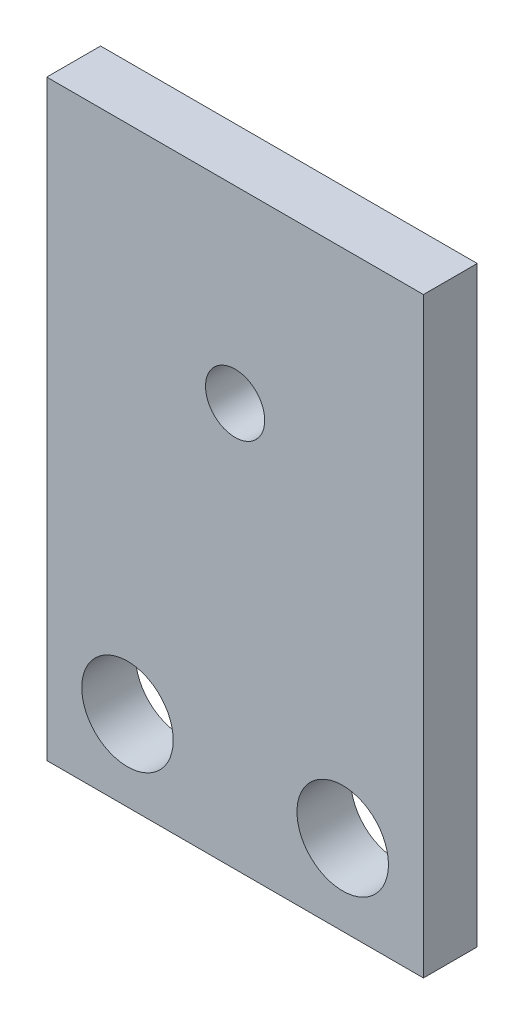
ISO-10303-21;
HEADER;
FILE_DESCRIPTION(('STEP AP214'),'2;1');
FILE_NAME('part.step','',(''),(''),'','','');
FILE_SCHEMA(('AUTOMOTIVE_DESIGN { 1 0 10303 214 1 1 1 1 }'));
ENDSEC;
DATA;
#1=APPLICATION_CONTEXT('core data for automotive mechanical design processes');
#2=APPLICATION_PROTOCOL_DEFINITION('international standard','automotive_design',2000,#1);
#3=PRODUCT_CONTEXT('',#1,'mechanical');
#4=PRODUCT('Part','Part','',(#3));
#5=PRODUCT_RELATED_PRODUCT_CATEGORY('part','',(#4));
#6=PRODUCT_DEFINITION_FORMATION('','',#4);
#7=PRODUCT_DEFINITION_CONTEXT('part definition',#1,'design');
#8=PRODUCT_DEFINITION('design','',#6,#7);
#9=PRODUCT_DEFINITION_SHAPE('','',#8);
#10=(LENGTH_UNIT() NAMED_UNIT(*) SI_UNIT(.MILLI.,.METRE.));
#11=(NAMED_UNIT(*) PLANE_ANGLE_UNIT() SI_UNIT($,.RADIAN.));
#12=(NAMED_UNIT(*) SI_UNIT($,.STERADIAN.) SOLID_ANGLE_UNIT());
#13=UNCERTAINTY_MEASURE_WITH_UNIT(LENGTH_MEASURE(1.E-05),#10,'distance_accuracy_value','');
#14=(GEOMETRIC_REPRESENTATION_CONTEXT(3) GLOBAL_UNCERTAINTY_ASSIGNED_CONTEXT((#13)) GLOBAL_UNIT_ASSIGNED_CONTEXT((#10,
#11,#12)) REPRESENTATION_CONTEXT('',''));
#15=CARTESIAN_POINT('',(0.,0.,0.));
#16=DIRECTION('',(0.,0.,1.));
#17=DIRECTION('',(1.,0.,0.));
#18=AXIS2_PLACEMENT_3D('',#15,#16,#17);
#19=CARTESIAN_POINT('',(0.,0.,2.));
#20=DIRECTION('',(0.,0.,-1.));
#21=DIRECTION('',(-1.,0.,0.));
#22=AXIS2_PLACEMENT_3D('',#19,#20,#21);
#23=PLANE('',#22);
#24=CARTESIAN_POINT('',(11.,3.,2.));
#25=DIRECTION('',(0.,0.,1.));
#26=DIRECTION('',(1.,0.,0.));
#27=AXIS2_PLACEMENT_3D('',#24,#25,#26);
#28=CIRCLE('',#27,1.7);
#29=CARTESIAN_POINT('',(12.7,3.,2.));
#30=VERTEX_POINT('',#29);
#31=EDGE_CURVE('E124',#30,#30,#28,.T.);
#32=ORIENTED_EDGE('',*,*,#31,.F.);
#33=EDGE_LOOP('',(#32));
#34=FACE_BOUND('',#33,.T.);
#35=DIRECTION('',(0.,-1.,0.));
#36=VECTOR('',#35,1.);
#37=CARTESIAN_POINT('',(0.,0.,2.));
#38=LINE('',#37,#36);
#39=CARTESIAN_POINT('',(0.,22.,2.));
#40=VERTEX_POINT('',#39);
#41=CARTESIAN_POINT('',(0.,0.,2.));
#42=VERTEX_POINT('',#41);
#43=EDGE_CURVE('E98',#40,#42,#38,.T.);
#44=ORIENTED_EDGE('',*,*,#43,.T.);
#45=DIRECTION('',(1.,0.,0.));
#46=VECTOR('',#45,1.);
#47=CARTESIAN_POINT('',(0.,0.,2.));
#48=LINE('',#47,#46);
#49=CARTESIAN_POINT('',(14.,0.,2.));
#50=VERTEX_POINT('',#49);
#51=EDGE_CURVE('E83',#42,#50,#48,.T.);
#52=ORIENTED_EDGE('',*,*,#51,.T.);
#53=DIRECTION('',(0.,1.,0.));
#54=VECTOR('',#53,1.);
#55=CARTESIAN_POINT('',(14.,0.,2.));
#56=LINE('',#55,#54);
#57=CARTESIAN_POINT('',(14.,22.,2.));
#58=VERTEX_POINT('',#57);
#59=EDGE_CURVE('E49',#50,#58,#56,.T.);
#60=ORIENTED_EDGE('',*,*,#59,.T.);
#61=DIRECTION('',(-1.,0.,0.));
#62=VECTOR('',#61,1.);
#63=CARTESIAN_POINT('',(0.,22.,2.));
#64=LINE('',#63,#62);
#65=EDGE_CURVE('E44',#58,#40,#64,.T.);
#66=ORIENTED_EDGE('',*,*,#65,.T.);
#67=EDGE_LOOP('',(#44,#52,#60,#66));
#68=FACE_BOUND('',#67,.T.);
#69=CARTESIAN_POINT('',(3.,3.,2.));
#70=DIRECTION('',(0.,0.,1.));
#71=DIRECTION('',(1.,0.,0.));
#72=AXIS2_PLACEMENT_3D('',#69,#70,#71);
#73=CIRCLE('',#72,1.7);
#74=CARTESIAN_POINT('',(4.7,3.,2.));
#75=VERTEX_POINT('',#74);
#76=EDGE_CURVE('E88',#75,#75,#73,.T.);
#77=ORIENTED_EDGE('',*,*,#76,.F.);
#78=EDGE_LOOP('',(#77));
#79=FACE_BOUND('',#78,.T.);
#80=CARTESIAN_POINT('',(7.,15.,2.));
#81=DIRECTION('',(0.,0.,1.));
#82=DIRECTION('',(1.,0.,0.));
#83=AXIS2_PLACEMENT_3D('',#80,#81,#82);
#84=CIRCLE('',#83,1.1);
#85=CARTESIAN_POINT('',(8.1,15.,2.));
#86=VERTEX_POINT('',#85);
#87=EDGE_CURVE('E118',#86,#86,#84,.T.);
#88=ORIENTED_EDGE('',*,*,#87,.F.);
#89=EDGE_LOOP('',(#88));
#90=FACE_BOUND('',#89,.T.);
#91=ADVANCED_FACE('F29',(#34,#68,#79,#90),#23,.F.);
#92=CARTESIAN_POINT('',(0.,0.,0.));
#93=DIRECTION('',(0.,0.,-1.));
#94=DIRECTION('',(-1.,0.,0.));
#95=AXIS2_PLACEMENT_3D('',#92,#93,#94);
#96=PLANE('',#95);
#97=CARTESIAN_POINT('',(11.,3.,0.));
#98=DIRECTION('',(0.,0.,1.));
#99=DIRECTION('',(1.,0.,0.));
#100=AXIS2_PLACEMENT_3D('',#97,#98,#99);
#101=CIRCLE('',#100,1.7);
#102=CARTESIAN_POINT('',(12.7,3.,0.));
#103=VERTEX_POINT('',#102);
#104=EDGE_CURVE('E120',#103,#103,#101,.T.);
#105=ORIENTED_EDGE('',*,*,#104,.T.);
#106=EDGE_LOOP('',(#105));
#107=FACE_BOUND('',#106,.T.);
#108=DIRECTION('',(0.,-1.,0.));
#109=VECTOR('',#108,1.);
#110=CARTESIAN_POINT('',(0.,0.,0.));
#111=LINE('',#110,#109);
#112=CARTESIAN_POINT('',(0.,22.,0.));
#113=VERTEX_POINT('',#112);
#114=CARTESIAN_POINT('',(0.,0.,0.));
#115=VERTEX_POINT('',#114);
#116=EDGE_CURVE('E75',#113,#115,#111,.T.);
#117=ORIENTED_EDGE('',*,*,#116,.F.);
#118=DIRECTION('',(-1.,0.,0.));
#119=VECTOR('',#118,1.);
#120=CARTESIAN_POINT('',(0.,22.,0.));
#121=LINE('',#120,#119);
#122=CARTESIAN_POINT('',(14.,22.,0.));
#123=VERTEX_POINT('',#122);
#124=EDGE_CURVE('E96',#123,#113,#121,.T.);
#125=ORIENTED_EDGE('',*,*,#124,.F.);
#126=DIRECTION('',(0.,1.,0.));
#127=VECTOR('',#126,1.);
#128=CARTESIAN_POINT('',(14.,0.,0.));
#129=LINE('',#128,#127);
#130=CARTESIAN_POINT('',(14.,0.,0.));
#131=VERTEX_POINT('',#130);
#132=EDGE_CURVE('E76',#131,#123,#129,.T.);
#133=ORIENTED_EDGE('',*,*,#132,.F.);
#134=DIRECTION('',(1.,0.,0.));
#135=VECTOR('',#134,1.);
#136=CARTESIAN_POINT('',(0.,0.,0.));
#137=LINE('',#136,#135);
#138=EDGE_CURVE('E70',#115,#131,#137,.T.);
#139=ORIENTED_EDGE('',*,*,#138,.F.);
#140=EDGE_LOOP('',(#117,#125,#133,#139));
#141=FACE_BOUND('',#140,.T.);
#142=CARTESIAN_POINT('',(3.,3.,0.));
#143=DIRECTION('',(0.,0.,1.));
#144=DIRECTION('',(1.,0.,0.));
#145=AXIS2_PLACEMENT_3D('',#142,#143,#144);
#146=CIRCLE('',#145,1.7);
#147=CARTESIAN_POINT('',(4.7,3.,0.));
#148=VERTEX_POINT('',#147);
#149=EDGE_CURVE('E91',#148,#148,#146,.T.);
#150=ORIENTED_EDGE('',*,*,#149,.T.);
#151=EDGE_LOOP('',(#150));
#152=FACE_BOUND('',#151,.T.);
#153=CARTESIAN_POINT('',(7.,15.,0.));
#154=DIRECTION('',(0.,0.,1.));
#155=DIRECTION('',(1.,0.,0.));
#156=AXIS2_PLACEMENT_3D('',#153,#154,#155);
#157=CIRCLE('',#156,1.1);
#158=CARTESIAN_POINT('',(8.1,15.,0.));
#159=VERTEX_POINT('',#158);
#160=EDGE_CURVE('E121',#159,#159,#157,.T.);
#161=ORIENTED_EDGE('',*,*,#160,.T.);
#162=EDGE_LOOP('',(#161));
#163=FACE_BOUND('',#162,.T.);
#164=ADVANCED_FACE('F71',(#107,#141,#152,#163),#96,.T.);
#165=CARTESIAN_POINT('',(0.,0.,2.));
#166=DIRECTION('',(1.,0.,0.));
#167=DIRECTION('',(0.,1.,0.));
#168=AXIS2_PLACEMENT_3D('',#165,#166,#167);
#169=PLANE('',#168);
#170=ORIENTED_EDGE('',*,*,#116,.T.);
#171=DIRECTION('',(0.,0.,-1.));
#172=VECTOR('',#171,1.);
#173=CARTESIAN_POINT('',(0.,0.,2.));
#174=LINE('',#173,#172);
#175=EDGE_CURVE('E11',#42,#115,#174,.T.);
#176=ORIENTED_EDGE('',*,*,#175,.F.);
#177=ORIENTED_EDGE('',*,*,#43,.F.);
#178=DIRECTION('',(0.,0.,-1.));
#179=VECTOR('',#178,1.);
#180=CARTESIAN_POINT('',(0.,22.,2.));
#181=LINE('',#180,#179);
#182=EDGE_CURVE('E87',#40,#113,#181,.T.);
#183=ORIENTED_EDGE('',*,*,#182,.T.);
#184=EDGE_LOOP('',(#170,#176,#177,#183));
#185=FACE_BOUND('',#184,.T.);
#186=ADVANCED_FACE('F31',(#185),#169,.F.);
#187=CARTESIAN_POINT('',(0.,0.,2.));
#188=DIRECTION('',(0.,1.,0.));
#189=DIRECTION('',(0.,0.,1.));
#190=AXIS2_PLACEMENT_3D('',#187,#188,#189);
#191=PLANE('',#190);
#192=ORIENTED_EDGE('',*,*,#138,.T.);
#193=DIRECTION('',(0.,0.,-1.));
#194=VECTOR('',#193,1.);
#195=CARTESIAN_POINT('',(14.,0.,2.));
#196=LINE('',#195,#194);
#197=EDGE_CURVE('E37',#50,#131,#196,.T.);
#198=ORIENTED_EDGE('',*,*,#197,.F.);
#199=ORIENTED_EDGE('',*,*,#51,.F.);
#200=ORIENTED_EDGE('',*,*,#175,.T.);
#201=EDGE_LOOP('',(#192,#198,#199,#200));
#202=FACE_BOUND('',#201,.T.);
#203=ADVANCED_FACE('F82',(#202),#191,.F.);
#204=CARTESIAN_POINT('',(14.,0.,2.));
#205=DIRECTION('',(-1.,0.,0.));
#206=DIRECTION('',(0.,-1.,0.));
#207=AXIS2_PLACEMENT_3D('',#204,#205,#206);
#208=PLANE('',#207);
#209=ORIENTED_EDGE('',*,*,#132,.T.);
#210=DIRECTION('',(0.,0.,-1.));
#211=VECTOR('',#210,1.);
#212=CARTESIAN_POINT('',(14.,22.,2.));
#213=LINE('',#212,#211);
#214=EDGE_CURVE('E104',#58,#123,#213,.T.);
#215=ORIENTED_EDGE('',*,*,#214,.F.);
#216=ORIENTED_EDGE('',*,*,#59,.F.);
#217=ORIENTED_EDGE('',*,*,#197,.T.);
#218=EDGE_LOOP('',(#209,#215,#216,#217));
#219=FACE_BOUND('',#218,.T.);
#220=ADVANCED_FACE('F107',(#219),#208,.F.);
#221=CARTESIAN_POINT('',(0.,22.,2.));
#222=DIRECTION('',(0.,-1.,0.));
#223=DIRECTION('',(0.,0.,-1.));
#224=AXIS2_PLACEMENT_3D('',#221,#222,#223);
#225=PLANE('',#224);
#226=ORIENTED_EDGE('',*,*,#124,.T.);
#227=ORIENTED_EDGE('',*,*,#182,.F.);
#228=ORIENTED_EDGE('',*,*,#65,.F.);
#229=ORIENTED_EDGE('',*,*,#214,.T.);
#230=EDGE_LOOP('',(#226,#227,#228,#229));
#231=FACE_BOUND('',#230,.T.);
#232=ADVANCED_FACE('F109',(#231),#225,.F.);
#233=CARTESIAN_POINT('',(3.,3.,2.));
#234=DIRECTION('',(0.,0.,-1.));
#235=DIRECTION('',(-1.,0.,0.));
#236=AXIS2_PLACEMENT_3D('',#233,#234,#235);
#237=CYLINDRICAL_SURFACE('',#236,1.7);
#238=ORIENTED_EDGE('',*,*,#76,.T.);
#239=EDGE_LOOP('',(#238));
#240=FACE_BOUND('',#239,.T.);
#241=ORIENTED_EDGE('',*,*,#149,.F.);
#242=EDGE_LOOP('',(#241));
#243=FACE_BOUND('',#242,.T.);
#244=ADVANCED_FACE('F134',(#240,#243),#237,.F.);
#245=CARTESIAN_POINT('',(11.,3.,2.));
#246=DIRECTION('',(0.,0.,-1.));
#247=DIRECTION('',(-1.,0.,0.));
#248=AXIS2_PLACEMENT_3D('',#245,#246,#247);
#249=CYLINDRICAL_SURFACE('',#248,1.7);
#250=ORIENTED_EDGE('',*,*,#31,.T.);
#251=EDGE_LOOP('',(#250));
#252=FACE_BOUND('',#251,.T.);
#253=ORIENTED_EDGE('',*,*,#104,.F.);
#254=EDGE_LOOP('',(#253));
#255=FACE_BOUND('',#254,.T.);
#256=ADVANCED_FACE('F136',(#252,#255),#249,.F.);
#257=CARTESIAN_POINT('',(7.,15.,2.));
#258=DIRECTION('',(0.,0.,-1.));
#259=DIRECTION('',(-1.,0.,0.));
#260=AXIS2_PLACEMENT_3D('',#257,#258,#259);
#261=CYLINDRICAL_SURFACE('',#260,1.1);
#262=ORIENTED_EDGE('',*,*,#87,.T.);
#263=EDGE_LOOP('',(#262));
#264=FACE_BOUND('',#263,.T.);
#265=ORIENTED_EDGE('',*,*,#160,.F.);
#266=EDGE_LOOP('',(#265));
#267=FACE_BOUND('',#266,.T.);
#268=ADVANCED_FACE('F143',(#264,#267),#261,.F.);
#269=CLOSED_SHELL('',(#91,#164,#186,#203,#220,#232,#244,#256,#268));
#270=MANIFOLD_SOLID_BREP('B2',#269);
#271=ADVANCED_BREP_SHAPE_REPRESENTATION('',(#18,#270),#14);
#272=SHAPE_DEFINITION_REPRESENTATION(#9,#271);
ENDSEC;
END-ISO-10303-21;
